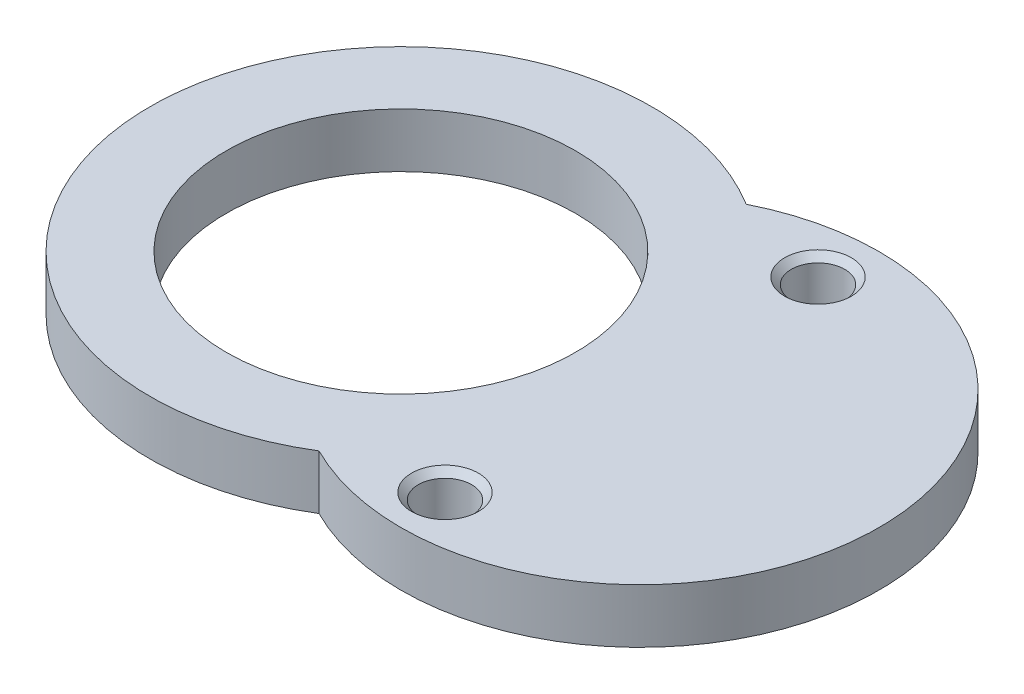
ISO-10303-21;
HEADER;
FILE_DESCRIPTION(('STEP AP214'),'2;1');
FILE_NAME('part.step','',(''),(''),'','','');
FILE_SCHEMA(('AUTOMOTIVE_DESIGN { 1 0 10303 214 1 1 1 1 }'));
ENDSEC;
DATA;
#1=APPLICATION_CONTEXT('core data for automotive mechanical design processes');
#2=APPLICATION_PROTOCOL_DEFINITION('international standard','automotive_design',2000,#1);
#3=PRODUCT_CONTEXT('',#1,'mechanical');
#4=PRODUCT('Part','Part','',(#3));
#5=PRODUCT_RELATED_PRODUCT_CATEGORY('part','',(#4));
#6=PRODUCT_DEFINITION_FORMATION('','',#4);
#7=PRODUCT_DEFINITION_CONTEXT('part definition',#1,'design');
#8=PRODUCT_DEFINITION('design','',#6,#7);
#9=PRODUCT_DEFINITION_SHAPE('','',#8);
#10=(LENGTH_UNIT() NAMED_UNIT(*) SI_UNIT(.MILLI.,.METRE.));
#11=(NAMED_UNIT(*) PLANE_ANGLE_UNIT() SI_UNIT($,.RADIAN.));
#12=(NAMED_UNIT(*) SI_UNIT($,.STERADIAN.) SOLID_ANGLE_UNIT());
#13=UNCERTAINTY_MEASURE_WITH_UNIT(LENGTH_MEASURE(1.E-05),#10,'distance_accuracy_value','');
#14=(GEOMETRIC_REPRESENTATION_CONTEXT(3) GLOBAL_UNCERTAINTY_ASSIGNED_CONTEXT((#13)) GLOBAL_UNIT_ASSIGNED_CONTEXT((#10,
#11,#12)) REPRESENTATION_CONTEXT('',''));
#15=CARTESIAN_POINT('',(0.,0.,0.));
#16=DIRECTION('',(0.,0.,1.));
#17=DIRECTION('',(1.,0.,0.));
#18=AXIS2_PLACEMENT_3D('',#15,#16,#17);
#19=CARTESIAN_POINT('',(8.9535,2.032,0.));
#20=DIRECTION('',(0.,-1.,0.));
#21=DIRECTION('',(0.,0.,-1.));
#22=AXIS2_PLACEMENT_3D('',#19,#20,#21);
#23=CYLINDRICAL_SURFACE('',#22,8.9535);
#24=CARTESIAN_POINT('',(8.9535,0.,0.));
#25=DIRECTION('',(0.,1.,0.));
#26=DIRECTION('',(0.,0.,1.));
#27=AXIS2_PLACEMENT_3D('',#24,#25,#26);
#28=CIRCLE('',#27,8.9535);
#29=CARTESIAN_POINT('',(4.93228368794326,0.,7.99968634520434));
#30=VERTEX_POINT('',#29);
#31=CARTESIAN_POINT('',(4.93228368794326,0.,-7.99968634520434));
#32=VERTEX_POINT('',#31);
#33=EDGE_CURVE('E66',#30,#32,#28,.T.);
#34=ORIENTED_EDGE('',*,*,#33,.T.);
#35=DIRECTION('',(0.,-1.,0.));
#36=VECTOR('',#35,1.);
#37=CARTESIAN_POINT('',(4.93228368794326,2.032,-7.99968634520434));
#38=LINE('',#37,#36);
#39=CARTESIAN_POINT('',(4.93228368794326,2.032,-7.99968634520434));
#40=VERTEX_POINT('',#39);
#41=EDGE_CURVE('E11',#40,#32,#38,.T.);
#42=ORIENTED_EDGE('',*,*,#41,.F.);
#43=CARTESIAN_POINT('',(8.9535,2.032,0.));
#44=DIRECTION('',(0.,1.,0.));
#45=DIRECTION('',(0.,0.,1.));
#46=AXIS2_PLACEMENT_3D('',#43,#44,#45);
#47=CIRCLE('',#46,8.9535);
#48=CARTESIAN_POINT('',(4.93228368794326,2.032,7.99968634520434));
#49=VERTEX_POINT('',#48);
#50=EDGE_CURVE('E65',#49,#40,#47,.T.);
#51=ORIENTED_EDGE('',*,*,#50,.F.);
#52=DIRECTION('',(0.,-1.,0.));
#53=VECTOR('',#52,1.);
#54=CARTESIAN_POINT('',(4.93228368794326,2.032,7.99968634520434));
#55=LINE('',#54,#53);
#56=EDGE_CURVE('E43',#49,#30,#55,.T.);
#57=ORIENTED_EDGE('',*,*,#56,.T.);
#58=EDGE_LOOP('',(#34,#42,#51,#57));
#59=FACE_BOUND('',#58,.T.);
#60=ADVANCED_FACE('F35',(#59),#23,.T.);
#61=CARTESIAN_POINT('',(0.,2.032,0.));
#62=DIRECTION('',(0.,-1.,0.));
#63=DIRECTION('',(0.,0.,-1.));
#64=AXIS2_PLACEMENT_3D('',#61,#62,#63);
#65=CYLINDRICAL_SURFACE('',#64,9.398);
#66=CARTESIAN_POINT('',(0.,0.,0.));
#67=DIRECTION('',(0.,1.,0.));
#68=DIRECTION('',(0.,0.,1.));
#69=AXIS2_PLACEMENT_3D('',#66,#67,#68);
#70=CIRCLE('',#69,9.398);
#71=EDGE_CURVE('E58',#32,#30,#70,.T.);
#72=ORIENTED_EDGE('',*,*,#71,.T.);
#73=ORIENTED_EDGE('',*,*,#56,.F.);
#74=CARTESIAN_POINT('',(0.,2.032,0.));
#75=DIRECTION('',(0.,1.,0.));
#76=DIRECTION('',(0.,0.,1.));
#77=AXIS2_PLACEMENT_3D('',#74,#75,#76);
#78=CIRCLE('',#77,9.398);
#79=EDGE_CURVE('E50',#40,#49,#78,.T.);
#80=ORIENTED_EDGE('',*,*,#79,.F.);
#81=ORIENTED_EDGE('',*,*,#41,.T.);
#82=EDGE_LOOP('',(#72,#73,#80,#81));
#83=FACE_BOUND('',#82,.T.);
#84=ADVANCED_FACE('F61',(#83),#65,.T.);
#85=CARTESIAN_POINT('',(4.47675,2.032,0.));
#86=DIRECTION('',(0.,1.,0.));
#87=DIRECTION('',(0.,0.,1.));
#88=AXIS2_PLACEMENT_3D('',#85,#86,#87);
#89=PLANE('',#88);
#90=CARTESIAN_POINT('',(8.636,2.032,-6.985));
#91=DIRECTION('',(0.,1.,0.));
#92=DIRECTION('',(0.,0.,1.));
#93=AXIS2_PLACEMENT_3D('',#90,#91,#92);
#94=CIRCLE('',#93,1.25);
#95=CARTESIAN_POINT('',(8.636,2.032,-5.735));
#96=VERTEX_POINT('',#95);
#97=EDGE_CURVE('E95',#96,#96,#94,.T.);
#98=ORIENTED_EDGE('',*,*,#97,.F.);
#99=EDGE_LOOP('',(#98));
#100=FACE_BOUND('',#99,.T.);
#101=CARTESIAN_POINT('',(8.636,2.032,6.985));
#102=DIRECTION('',(0.,1.,0.));
#103=DIRECTION('',(0.,0.,1.));
#104=AXIS2_PLACEMENT_3D('',#101,#102,#103);
#105=CIRCLE('',#104,1.25);
#106=CARTESIAN_POINT('',(8.636,2.032,8.235));
#107=VERTEX_POINT('',#106);
#108=EDGE_CURVE('E86',#107,#107,#105,.T.);
#109=ORIENTED_EDGE('',*,*,#108,.F.);
#110=EDGE_LOOP('',(#109));
#111=FACE_BOUND('',#110,.T.);
#112=CARTESIAN_POINT('',(0.,2.032,0.));
#113=DIRECTION('',(0.,1.,0.));
#114=DIRECTION('',(0.,0.,1.));
#115=AXIS2_PLACEMENT_3D('',#112,#113,#114);
#116=CIRCLE('',#115,6.5405);
#117=CARTESIAN_POINT('',(0.,2.032,6.5405));
#118=VERTEX_POINT('',#117);
#119=EDGE_CURVE('E73',#118,#118,#116,.T.);
#120=ORIENTED_EDGE('',*,*,#119,.F.);
#121=EDGE_LOOP('',(#120));
#122=FACE_BOUND('',#121,.T.);
#123=ORIENTED_EDGE('',*,*,#50,.T.);
#124=ORIENTED_EDGE('',*,*,#79,.T.);
#125=EDGE_LOOP('',(#123,#124));
#126=FACE_BOUND('',#125,.T.);
#127=ADVANCED_FACE('F101',(#100,#111,#122,#126),#89,.T.);
#128=CARTESIAN_POINT('',(4.47675,0.,0.));
#129=DIRECTION('',(0.,1.,0.));
#130=DIRECTION('',(0.,0.,1.));
#131=AXIS2_PLACEMENT_3D('',#128,#129,#130);
#132=PLANE('',#131);
#133=CARTESIAN_POINT('',(8.636,0.,-6.985));
#134=DIRECTION('',(0.,1.,0.));
#135=DIRECTION('',(0.,0.,1.));
#136=AXIS2_PLACEMENT_3D('',#133,#134,#135);
#137=CIRCLE('',#136,0.999999999999999);
#138=CARTESIAN_POINT('',(8.636,0.,-5.985));
#139=VERTEX_POINT('',#138);
#140=EDGE_CURVE('E89',#139,#139,#137,.T.);
#141=ORIENTED_EDGE('',*,*,#140,.T.);
#142=EDGE_LOOP('',(#141));
#143=FACE_BOUND('',#142,.T.);
#144=CARTESIAN_POINT('',(8.636,0.,6.985));
#145=DIRECTION('',(0.,1.,0.));
#146=DIRECTION('',(0.,0.,1.));
#147=AXIS2_PLACEMENT_3D('',#144,#145,#146);
#148=CIRCLE('',#147,0.999999999999999);
#149=CARTESIAN_POINT('',(8.636,0.,7.985));
#150=VERTEX_POINT('',#149);
#151=EDGE_CURVE('E79',#150,#150,#148,.T.);
#152=ORIENTED_EDGE('',*,*,#151,.T.);
#153=EDGE_LOOP('',(#152));
#154=FACE_BOUND('',#153,.T.);
#155=CARTESIAN_POINT('',(0.,0.,0.));
#156=DIRECTION('',(0.,1.,0.));
#157=DIRECTION('',(0.,0.,1.));
#158=AXIS2_PLACEMENT_3D('',#155,#156,#157);
#159=CIRCLE('',#158,6.5405);
#160=CARTESIAN_POINT('',(0.,0.,6.5405));
#161=VERTEX_POINT('',#160);
#162=EDGE_CURVE('E70',#161,#161,#159,.T.);
#163=ORIENTED_EDGE('',*,*,#162,.T.);
#164=EDGE_LOOP('',(#163));
#165=FACE_BOUND('',#164,.T.);
#166=ORIENTED_EDGE('',*,*,#33,.F.);
#167=ORIENTED_EDGE('',*,*,#71,.F.);
#168=EDGE_LOOP('',(#166,#167));
#169=FACE_BOUND('',#168,.T.);
#170=ADVANCED_FACE('F69',(#143,#154,#165,#169),#132,.F.);
#171=CARTESIAN_POINT('',(0.,0.,0.));
#172=DIRECTION('',(0.,1.,0.));
#173=DIRECTION('',(0.,0.,1.));
#174=AXIS2_PLACEMENT_3D('',#171,#172,#173);
#175=CYLINDRICAL_SURFACE('',#174,6.5405);
#176=ORIENTED_EDGE('',*,*,#162,.F.);
#177=EDGE_LOOP('',(#176));
#178=FACE_BOUND('',#177,.T.);
#179=ORIENTED_EDGE('',*,*,#119,.T.);
#180=EDGE_LOOP('',(#179));
#181=FACE_BOUND('',#180,.T.);
#182=ADVANCED_FACE('F109',(#178,#181),#175,.F.);
#183=CARTESIAN_POINT('',(8.636,2.032,6.985));
#184=DIRECTION('',(0.,1.,0.));
#185=DIRECTION('',(0.,0.,1.));
#186=AXIS2_PLACEMENT_3D('',#183,#184,#185);
#187=CYLINDRICAL_SURFACE('',#186,0.999999999999999);
#188=ORIENTED_EDGE('',*,*,#151,.F.);
#189=EDGE_LOOP('',(#188));
#190=FACE_BOUND('',#189,.T.);
#191=CARTESIAN_POINT('',(8.636,1.782,6.985));
#192=DIRECTION('',(0.,1.,0.));
#193=DIRECTION('',(0.,0.,1.));
#194=AXIS2_PLACEMENT_3D('',#191,#192,#193);
#195=CIRCLE('',#194,0.999999999999999);
#196=CARTESIAN_POINT('',(8.636,1.782,7.985));
#197=VERTEX_POINT('',#196);
#198=EDGE_CURVE('E83',#197,#197,#195,.T.);
#199=ORIENTED_EDGE('',*,*,#198,.T.);
#200=EDGE_LOOP('',(#199));
#201=FACE_BOUND('',#200,.T.);
#202=ADVANCED_FACE('F111',(#190,#201),#187,.F.);
#203=CARTESIAN_POINT('',(8.636,2.032,6.985));
#204=DIRECTION('',(0.,1.,0.));
#205=DIRECTION('',(0.,0.,1.));
#206=AXIS2_PLACEMENT_3D('',#203,#204,#205);
#207=CONICAL_SURFACE('',#206,1.25,0.785398163397449);
#208=ORIENTED_EDGE('',*,*,#198,.F.);
#209=EDGE_LOOP('',(#208));
#210=FACE_BOUND('',#209,.T.);
#211=ORIENTED_EDGE('',*,*,#108,.T.);
#212=EDGE_LOOP('',(#211));
#213=FACE_BOUND('',#212,.T.);
#214=ADVANCED_FACE('F118',(#210,#213),#207,.F.);
#215=CARTESIAN_POINT('',(8.636,2.032,-6.985));
#216=DIRECTION('',(0.,1.,0.));
#217=DIRECTION('',(0.,0.,1.));
#218=AXIS2_PLACEMENT_3D('',#215,#216,#217);
#219=CYLINDRICAL_SURFACE('',#218,0.999999999999999);
#220=ORIENTED_EDGE('',*,*,#140,.F.);
#221=EDGE_LOOP('',(#220));
#222=FACE_BOUND('',#221,.T.);
#223=CARTESIAN_POINT('',(8.636,1.782,-6.985));
#224=DIRECTION('',(0.,1.,0.));
#225=DIRECTION('',(0.,0.,1.));
#226=AXIS2_PLACEMENT_3D('',#223,#224,#225);
#227=CIRCLE('',#226,0.999999999999999);
#228=CARTESIAN_POINT('',(8.636,1.782,-5.985));
#229=VERTEX_POINT('',#228);
#230=EDGE_CURVE('E92',#229,#229,#227,.T.);
#231=ORIENTED_EDGE('',*,*,#230,.T.);
#232=EDGE_LOOP('',(#231));
#233=FACE_BOUND('',#232,.T.);
#234=ADVANCED_FACE('F154',(#222,#233),#219,.F.);
#235=CARTESIAN_POINT('',(8.636,2.032,-6.985));
#236=DIRECTION('',(0.,1.,0.));
#237=DIRECTION('',(0.,0.,1.));
#238=AXIS2_PLACEMENT_3D('',#235,#236,#237);
#239=CONICAL_SURFACE('',#238,1.25,0.785398163397449);
#240=ORIENTED_EDGE('',*,*,#230,.F.);
#241=EDGE_LOOP('',(#240));
#242=FACE_BOUND('',#241,.T.);
#243=ORIENTED_EDGE('',*,*,#97,.T.);
#244=EDGE_LOOP('',(#243));
#245=FACE_BOUND('',#244,.T.);
#246=ADVANCED_FACE('F99',(#242,#245),#239,.F.);
#247=CLOSED_SHELL('',(#60,#84,#127,#170,#182,#202,#214,#234,#246));
#248=MANIFOLD_SOLID_BREP('B2',#247);
#249=ADVANCED_BREP_SHAPE_REPRESENTATION('',(#18,#248),#14);
#250=SHAPE_DEFINITION_REPRESENTATION(#9,#249);
ENDSEC;
END-ISO-10303-21;
